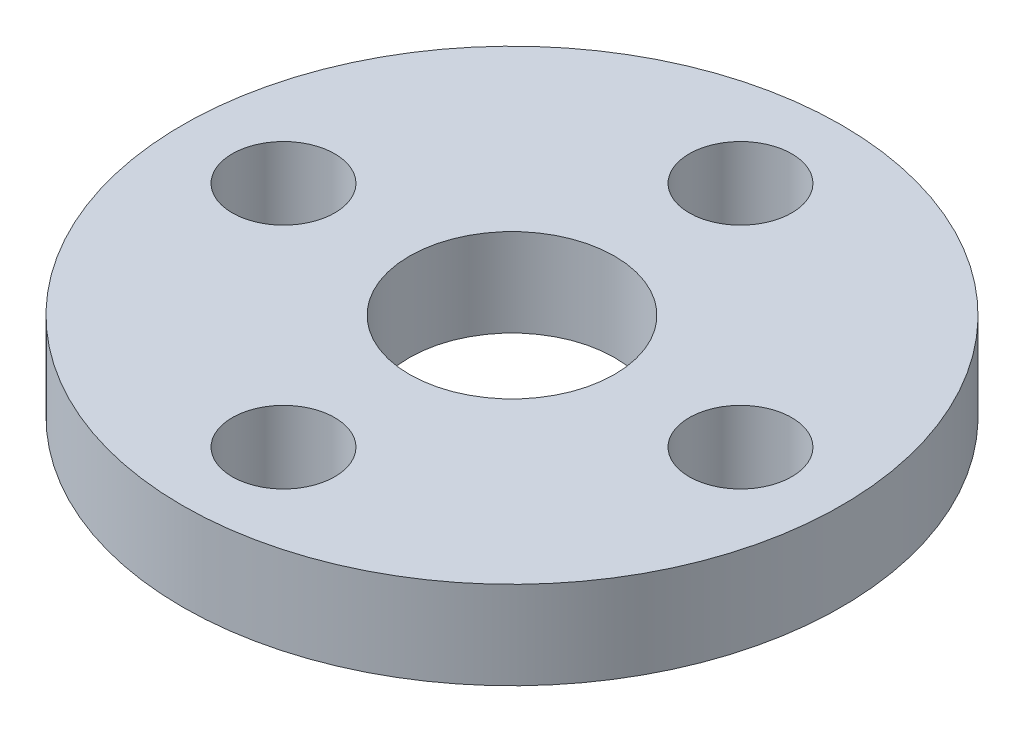
ISO-10303-21;
HEADER;
FILE_DESCRIPTION(('STEP AP214'),'2;1');
FILE_NAME('part.step','',(''),(''),'','','');
FILE_SCHEMA(('AUTOMOTIVE_DESIGN { 1 0 10303 214 1 1 1 1 }'));
ENDSEC;
DATA;
#1=APPLICATION_CONTEXT('core data for automotive mechanical design processes');
#2=APPLICATION_PROTOCOL_DEFINITION('international standard','automotive_design',2000,#1);
#3=PRODUCT_CONTEXT('',#1,'mechanical');
#4=PRODUCT('Part','Part','',(#3));
#5=PRODUCT_RELATED_PRODUCT_CATEGORY('part','',(#4));
#6=PRODUCT_DEFINITION_FORMATION('','',#4);
#7=PRODUCT_DEFINITION_CONTEXT('part definition',#1,'design');
#8=PRODUCT_DEFINITION('design','',#6,#7);
#9=PRODUCT_DEFINITION_SHAPE('','',#8);
#10=(LENGTH_UNIT() NAMED_UNIT(*) SI_UNIT(.MILLI.,.METRE.));
#11=(NAMED_UNIT(*) PLANE_ANGLE_UNIT() SI_UNIT($,.RADIAN.));
#12=(NAMED_UNIT(*) SI_UNIT($,.STERADIAN.) SOLID_ANGLE_UNIT());
#13=UNCERTAINTY_MEASURE_WITH_UNIT(LENGTH_MEASURE(1.E-05),#10,'distance_accuracy_value','');
#14=(GEOMETRIC_REPRESENTATION_CONTEXT(3) GLOBAL_UNCERTAINTY_ASSIGNED_CONTEXT((#13)) GLOBAL_UNIT_ASSIGNED_CONTEXT((#10,
#11,#12)) REPRESENTATION_CONTEXT('',''));
#15=CARTESIAN_POINT('',(0.,0.,0.));
#16=DIRECTION('',(0.,0.,1.));
#17=DIRECTION('',(1.,0.,0.));
#18=AXIS2_PLACEMENT_3D('',#15,#16,#17);
#19=CARTESIAN_POINT('',(0.,3.,0.));
#20=DIRECTION('',(0.,-1.,0.));
#21=DIRECTION('',(0.,0.,-1.));
#22=AXIS2_PLACEMENT_3D('',#19,#20,#21);
#23=CYLINDRICAL_SURFACE('',#22,11.25);
#24=CARTESIAN_POINT('',(0.,3.,0.));
#25=DIRECTION('',(0.,1.,0.));
#26=DIRECTION('',(0.,0.,1.));
#27=AXIS2_PLACEMENT_3D('',#24,#25,#26);
#28=CIRCLE('',#27,11.25);
#29=CARTESIAN_POINT('',(0.,3.,11.25));
#30=VERTEX_POINT('',#29);
#31=EDGE_CURVE('E10',#30,#30,#28,.T.);
#32=ORIENTED_EDGE('',*,*,#31,.F.);
#33=EDGE_LOOP('',(#32));
#34=FACE_BOUND('',#33,.T.);
#35=CARTESIAN_POINT('',(0.,0.,0.));
#36=DIRECTION('',(0.,1.,0.));
#37=DIRECTION('',(0.,0.,1.));
#38=AXIS2_PLACEMENT_3D('',#35,#36,#37);
#39=CIRCLE('',#38,11.25);
#40=CARTESIAN_POINT('',(0.,0.,11.25));
#41=VERTEX_POINT('',#40);
#42=EDGE_CURVE('E34',#41,#41,#39,.T.);
#43=ORIENTED_EDGE('',*,*,#42,.T.);
#44=EDGE_LOOP('',(#43));
#45=FACE_BOUND('',#44,.T.);
#46=ADVANCED_FACE('F31',(#34,#45),#23,.T.);
#47=CARTESIAN_POINT('',(0.,3.,0.));
#48=DIRECTION('',(0.,1.,0.));
#49=DIRECTION('',(0.,0.,1.));
#50=AXIS2_PLACEMENT_3D('',#47,#48,#49);
#51=PLANE('',#50);
#52=CARTESIAN_POINT('',(0.,3.,-7.8));
#53=DIRECTION('',(0.,1.,0.));
#54=DIRECTION('',(0.,0.,1.));
#55=AXIS2_PLACEMENT_3D('',#52,#53,#54);
#56=CIRCLE('',#55,1.75);
#57=CARTESIAN_POINT('',(0.,3.,-6.05));
#58=VERTEX_POINT('',#57);
#59=EDGE_CURVE('E54',#58,#58,#56,.T.);
#60=ORIENTED_EDGE('',*,*,#59,.F.);
#61=EDGE_LOOP('',(#60));
#62=FACE_BOUND('',#61,.T.);
#63=CARTESIAN_POINT('',(0.,3.,0.));
#64=DIRECTION('',(0.,1.,0.));
#65=DIRECTION('',(0.,0.,1.));
#66=AXIS2_PLACEMENT_3D('',#63,#64,#65);
#67=CIRCLE('',#66,3.5);
#68=CARTESIAN_POINT('',(0.,3.,3.5));
#69=VERTEX_POINT('',#68);
#70=EDGE_CURVE('E61',#69,#69,#67,.T.);
#71=ORIENTED_EDGE('',*,*,#70,.F.);
#72=EDGE_LOOP('',(#71));
#73=FACE_BOUND('',#72,.T.);
#74=CARTESIAN_POINT('',(-7.8,3.,0.));
#75=DIRECTION('',(0.,1.,0.));
#76=DIRECTION('',(0.,0.,1.));
#77=AXIS2_PLACEMENT_3D('',#74,#75,#76);
#78=CIRCLE('',#77,1.75);
#79=CARTESIAN_POINT('',(-7.8,3.,1.75));
#80=VERTEX_POINT('',#79);
#81=EDGE_CURVE('E60',#80,#80,#78,.T.);
#82=ORIENTED_EDGE('',*,*,#81,.F.);
#83=EDGE_LOOP('',(#82));
#84=FACE_BOUND('',#83,.T.);
#85=CARTESIAN_POINT('',(0.,3.,7.8));
#86=DIRECTION('',(0.,1.,0.));
#87=DIRECTION('',(0.,0.,1.));
#88=AXIS2_PLACEMENT_3D('',#85,#86,#87);
#89=CIRCLE('',#88,1.75);
#90=CARTESIAN_POINT('',(0.,3.,9.55));
#91=VERTEX_POINT('',#90);
#92=EDGE_CURVE('E47',#91,#91,#89,.T.);
#93=ORIENTED_EDGE('',*,*,#92,.F.);
#94=EDGE_LOOP('',(#93));
#95=FACE_BOUND('',#94,.T.);
#96=CARTESIAN_POINT('',(7.8,3.,0.));
#97=DIRECTION('',(0.,1.,0.));
#98=DIRECTION('',(0.,0.,1.));
#99=AXIS2_PLACEMENT_3D('',#96,#97,#98);
#100=CIRCLE('',#99,1.75);
#101=CARTESIAN_POINT('',(7.8,3.,1.75));
#102=VERTEX_POINT('',#101);
#103=EDGE_CURVE('E46',#102,#102,#100,.T.);
#104=ORIENTED_EDGE('',*,*,#103,.F.);
#105=EDGE_LOOP('',(#104));
#106=FACE_BOUND('',#105,.T.);
#107=ORIENTED_EDGE('',*,*,#31,.T.);
#108=EDGE_LOOP('',(#107));
#109=FACE_BOUND('',#108,.T.);
#110=ADVANCED_FACE('F76',(#62,#73,#84,#95,#106,#109),#51,.T.);
#111=CARTESIAN_POINT('',(0.,0.,0.));
#112=DIRECTION('',(0.,1.,0.));
#113=DIRECTION('',(0.,0.,1.));
#114=AXIS2_PLACEMENT_3D('',#111,#112,#113);
#115=PLANE('',#114);
#116=CARTESIAN_POINT('',(0.,0.,-7.8));
#117=DIRECTION('',(0.,1.,0.));
#118=DIRECTION('',(0.,0.,1.));
#119=AXIS2_PLACEMENT_3D('',#116,#117,#118);
#120=CIRCLE('',#119,1.75);
#121=CARTESIAN_POINT('',(0.,0.,-6.05));
#122=VERTEX_POINT('',#121);
#123=EDGE_CURVE('E41',#122,#122,#120,.F.);
#124=ORIENTED_EDGE('',*,*,#123,.F.);
#125=EDGE_LOOP('',(#124));
#126=FACE_BOUND('',#125,.T.);
#127=CARTESIAN_POINT('',(0.,0.,0.));
#128=DIRECTION('',(0.,1.,0.));
#129=DIRECTION('',(0.,0.,1.));
#130=AXIS2_PLACEMENT_3D('',#127,#128,#129);
#131=CIRCLE('',#130,3.5);
#132=CARTESIAN_POINT('',(0.,0.,3.5));
#133=VERTEX_POINT('',#132);
#134=EDGE_CURVE('E57',#133,#133,#131,.F.);
#135=ORIENTED_EDGE('',*,*,#134,.F.);
#136=EDGE_LOOP('',(#135));
#137=FACE_BOUND('',#136,.T.);
#138=CARTESIAN_POINT('',(-7.8,0.,0.));
#139=DIRECTION('',(0.,1.,0.));
#140=DIRECTION('',(0.,0.,1.));
#141=AXIS2_PLACEMENT_3D('',#138,#139,#140);
#142=CIRCLE('',#141,1.75);
#143=CARTESIAN_POINT('',(-7.8,0.,1.75));
#144=VERTEX_POINT('',#143);
#145=EDGE_CURVE('E50',#144,#144,#142,.F.);
#146=ORIENTED_EDGE('',*,*,#145,.F.);
#147=EDGE_LOOP('',(#146));
#148=FACE_BOUND('',#147,.T.);
#149=CARTESIAN_POINT('',(0.,0.,7.8));
#150=DIRECTION('',(0.,1.,0.));
#151=DIRECTION('',(0.,0.,1.));
#152=AXIS2_PLACEMENT_3D('',#149,#150,#151);
#153=CIRCLE('',#152,1.75);
#154=CARTESIAN_POINT('',(0.,0.,9.55));
#155=VERTEX_POINT('',#154);
#156=EDGE_CURVE('E43',#155,#155,#153,.F.);
#157=ORIENTED_EDGE('',*,*,#156,.F.);
#158=EDGE_LOOP('',(#157));
#159=FACE_BOUND('',#158,.T.);
#160=CARTESIAN_POINT('',(7.8,0.,0.));
#161=DIRECTION('',(0.,1.,0.));
#162=DIRECTION('',(0.,0.,1.));
#163=AXIS2_PLACEMENT_3D('',#160,#161,#162);
#164=CIRCLE('',#163,1.75);
#165=CARTESIAN_POINT('',(7.8,0.,1.75));
#166=VERTEX_POINT('',#165);
#167=EDGE_CURVE('E51',#166,#166,#164,.F.);
#168=ORIENTED_EDGE('',*,*,#167,.F.);
#169=EDGE_LOOP('',(#168));
#170=FACE_BOUND('',#169,.T.);
#171=ORIENTED_EDGE('',*,*,#42,.F.);
#172=EDGE_LOOP('',(#171));
#173=FACE_BOUND('',#172,.T.);
#174=ADVANCED_FACE('F79',(#126,#137,#148,#159,#170,#173),#115,.F.);
#175=CARTESIAN_POINT('',(7.8,-0.00100000000000013,0.));
#176=DIRECTION('',(0.,1.,0.));
#177=DIRECTION('',(0.,0.,1.));
#178=AXIS2_PLACEMENT_3D('',#175,#176,#177);
#179=CYLINDRICAL_SURFACE('',#178,1.75);
#180=CARTESIAN_POINT('',(7.8,3.,1.75));
#181=CARTESIAN_POINT('',(7.8,2.96875,1.75));
#182=CARTESIAN_POINT('',(7.8,2.9375,1.75));
#183=CARTESIAN_POINT('',(7.8,2.875,1.75));
#184=CARTESIAN_POINT('',(7.8,2.84375,1.75));
#185=CARTESIAN_POINT('',(7.8,2.78125,1.75));
#186=CARTESIAN_POINT('',(7.8,2.75,1.75));
#187=CARTESIAN_POINT('',(7.8,2.6875,1.75));
#188=CARTESIAN_POINT('',(7.8,2.65625,1.75));
#189=CARTESIAN_POINT('',(7.8,2.59375,1.75));
#190=CARTESIAN_POINT('',(7.8,2.5625,1.75));
#191=CARTESIAN_POINT('',(7.8,2.5,1.75));
#192=CARTESIAN_POINT('',(7.8,2.46875,1.75));
#193=CARTESIAN_POINT('',(7.8,2.40625,1.75));
#194=CARTESIAN_POINT('',(7.8,2.375,1.75));
#195=CARTESIAN_POINT('',(7.8,2.3125,1.75));
#196=CARTESIAN_POINT('',(7.8,2.28125,1.75));
#197=CARTESIAN_POINT('',(7.8,2.21875,1.75));
#198=CARTESIAN_POINT('',(7.8,2.1875,1.75));
#199=CARTESIAN_POINT('',(7.8,2.125,1.75));
#200=CARTESIAN_POINT('',(7.8,2.09375,1.75));
#201=CARTESIAN_POINT('',(7.8,2.03125,1.75));
#202=CARTESIAN_POINT('',(7.8,2.,1.75));
#203=CARTESIAN_POINT('',(7.8,1.9375,1.75));
#204=CARTESIAN_POINT('',(7.8,1.90625,1.75));
#205=CARTESIAN_POINT('',(7.8,1.84375,1.75));
#206=CARTESIAN_POINT('',(7.8,1.8125,1.75));
#207=CARTESIAN_POINT('',(7.8,1.75,1.75));
#208=CARTESIAN_POINT('',(7.8,1.71875,1.75));
#209=CARTESIAN_POINT('',(7.8,1.65625,1.75));
#210=CARTESIAN_POINT('',(7.8,1.625,1.75));
#211=CARTESIAN_POINT('',(7.8,1.5625,1.75));
#212=CARTESIAN_POINT('',(7.8,1.53125,1.75));
#213=CARTESIAN_POINT('',(7.8,1.46875,1.75));
#214=CARTESIAN_POINT('',(7.8,1.4375,1.75));
#215=CARTESIAN_POINT('',(7.8,1.375,1.75));
#216=CARTESIAN_POINT('',(7.8,1.34375,1.75));
#217=CARTESIAN_POINT('',(7.8,1.28125,1.75));
#218=CARTESIAN_POINT('',(7.8,1.25,1.75));
#219=CARTESIAN_POINT('',(7.8,1.1875,1.75));
#220=CARTESIAN_POINT('',(7.8,1.15625,1.75));
#221=CARTESIAN_POINT('',(7.8,1.09375,1.75));
#222=CARTESIAN_POINT('',(7.8,1.0625,1.75));
#223=CARTESIAN_POINT('',(7.8,1.,1.75));
#224=CARTESIAN_POINT('',(7.8,0.96875,1.75));
#225=CARTESIAN_POINT('',(7.8,0.90625,1.75));
#226=CARTESIAN_POINT('',(7.8,0.875,1.75));
#227=CARTESIAN_POINT('',(7.8,0.8125,1.75));
#228=CARTESIAN_POINT('',(7.8,0.78125,1.75));
#229=CARTESIAN_POINT('',(7.8,0.71875,1.75));
#230=CARTESIAN_POINT('',(7.8,0.6875,1.75));
#231=CARTESIAN_POINT('',(7.8,0.625,1.75));
#232=CARTESIAN_POINT('',(7.8,0.59375,1.75));
#233=CARTESIAN_POINT('',(7.8,0.53125,1.75));
#234=CARTESIAN_POINT('',(7.8,0.5,1.75));
#235=CARTESIAN_POINT('',(7.8,0.4375,1.75));
#236=CARTESIAN_POINT('',(7.8,0.40625,1.75));
#237=CARTESIAN_POINT('',(7.8,0.34375,1.75));
#238=CARTESIAN_POINT('',(7.8,0.3125,1.75));
#239=CARTESIAN_POINT('',(7.8,0.25,1.75));
#240=CARTESIAN_POINT('',(7.8,0.21875,1.75));
#241=CARTESIAN_POINT('',(7.8,0.15625,1.75));
#242=CARTESIAN_POINT('',(7.8,0.125,1.75));
#243=CARTESIAN_POINT('',(7.8,0.0625000000000001,1.75));
#244=CARTESIAN_POINT('',(7.8,0.0312500000000001,1.75));
#245=CARTESIAN_POINT('',(7.8,0.,1.75));
#246=B_SPLINE_CURVE_WITH_KNOTS('',3,(#180,#181,#182,#183,#184,#185,#186,#187,#188,#189,#190,
#191,#192,#193,#194,#195,#196,#197,#198,#199,#200,#201,#202,#203,#204,#205,#206,#207,#208,#209,
#210,#211,#212,#213,#214,#215,#216,#217,#218,#219,#220,#221,#222,#223,#224,#225,#226,#227,#228,
#229,#230,#231,#232,#233,#234,#235,#236,#237,#238,#239,#240,#241,#242,#243,#244,#245),
.UNSPECIFIED.,.F.,.F.,(4,2,2,2,2,2,2,2,2,2,2,2,2,2,2,2,2,2,2,2,2,2,2,2,2,2,2,2,2,2,2,2,4),(0.,
0.0937500000000001,0.1875,0.28125,0.375,0.46875,0.5625,0.65625,0.75,0.84375,0.9375,1.03125,
1.125,1.21875,1.3125,1.40625,1.5,1.59375,1.6875,1.78125,1.875,1.96875,2.0625,2.15625,2.25,
2.34375,2.4375,2.53125,2.625,2.71875,2.8125,2.90625,3.),.UNSPECIFIED.);
#247=EDGE_CURVE('BSEAM89',#102,#166,#246,.T.);
#248=ORIENTED_EDGE('',*,*,#103,.T.);
#249=ORIENTED_EDGE('',*,*,#167,.T.);
#250=ORIENTED_EDGE('',*,*,#247,.T.);
#251=ORIENTED_EDGE('',*,*,#247,.F.);
#252=EDGE_LOOP('',(#248,#250,#249,#251));
#253=FACE_BOUND('',#252,.T.);
#254=ADVANCED_FACE('F89',(#253),#179,.F.);
#255=CARTESIAN_POINT('',(0.,-0.00100000000000013,7.8));
#256=DIRECTION('',(0.,1.,0.));
#257=DIRECTION('',(0.,0.,1.));
#258=AXIS2_PLACEMENT_3D('',#255,#256,#257);
#259=CYLINDRICAL_SURFACE('',#258,1.75);
#260=CARTESIAN_POINT('',(0.,3.,9.55));
#261=CARTESIAN_POINT('',(0.,2.96875,9.55));
#262=CARTESIAN_POINT('',(0.,2.9375,9.55));
#263=CARTESIAN_POINT('',(0.,2.875,9.55));
#264=CARTESIAN_POINT('',(0.,2.84375,9.55));
#265=CARTESIAN_POINT('',(0.,2.78125,9.55));
#266=CARTESIAN_POINT('',(0.,2.75,9.55));
#267=CARTESIAN_POINT('',(0.,2.6875,9.55));
#268=CARTESIAN_POINT('',(0.,2.65625,9.55));
#269=CARTESIAN_POINT('',(0.,2.59375,9.55));
#270=CARTESIAN_POINT('',(0.,2.5625,9.55));
#271=CARTESIAN_POINT('',(0.,2.5,9.55));
#272=CARTESIAN_POINT('',(0.,2.46875,9.55));
#273=CARTESIAN_POINT('',(0.,2.40625,9.55));
#274=CARTESIAN_POINT('',(0.,2.375,9.55));
#275=CARTESIAN_POINT('',(0.,2.3125,9.55));
#276=CARTESIAN_POINT('',(0.,2.28125,9.55));
#277=CARTESIAN_POINT('',(0.,2.21875,9.55));
#278=CARTESIAN_POINT('',(0.,2.1875,9.55));
#279=CARTESIAN_POINT('',(0.,2.125,9.55));
#280=CARTESIAN_POINT('',(0.,2.09375,9.55));
#281=CARTESIAN_POINT('',(0.,2.03125,9.55));
#282=CARTESIAN_POINT('',(0.,2.,9.55));
#283=CARTESIAN_POINT('',(0.,1.9375,9.55));
#284=CARTESIAN_POINT('',(0.,1.90625,9.55));
#285=CARTESIAN_POINT('',(0.,1.84375,9.55));
#286=CARTESIAN_POINT('',(0.,1.8125,9.55));
#287=CARTESIAN_POINT('',(0.,1.75,9.55));
#288=CARTESIAN_POINT('',(0.,1.71875,9.55));
#289=CARTESIAN_POINT('',(0.,1.65625,9.55));
#290=CARTESIAN_POINT('',(0.,1.625,9.55));
#291=CARTESIAN_POINT('',(0.,1.5625,9.55));
#292=CARTESIAN_POINT('',(0.,1.53125,9.55));
#293=CARTESIAN_POINT('',(0.,1.46875,9.55));
#294=CARTESIAN_POINT('',(0.,1.4375,9.55));
#295=CARTESIAN_POINT('',(0.,1.375,9.55));
#296=CARTESIAN_POINT('',(0.,1.34375,9.55));
#297=CARTESIAN_POINT('',(0.,1.28125,9.55));
#298=CARTESIAN_POINT('',(0.,1.25,9.55));
#299=CARTESIAN_POINT('',(0.,1.1875,9.55));
#300=CARTESIAN_POINT('',(0.,1.15625,9.55));
#301=CARTESIAN_POINT('',(0.,1.09375,9.55));
#302=CARTESIAN_POINT('',(0.,1.0625,9.55));
#303=CARTESIAN_POINT('',(0.,1.,9.55));
#304=CARTESIAN_POINT('',(0.,0.96875,9.55));
#305=CARTESIAN_POINT('',(0.,0.90625,9.55));
#306=CARTESIAN_POINT('',(0.,0.875,9.55));
#307=CARTESIAN_POINT('',(0.,0.8125,9.55));
#308=CARTESIAN_POINT('',(0.,0.78125,9.55));
#309=CARTESIAN_POINT('',(0.,0.71875,9.55));
#310=CARTESIAN_POINT('',(0.,0.6875,9.55));
#311=CARTESIAN_POINT('',(0.,0.625,9.55));
#312=CARTESIAN_POINT('',(0.,0.59375,9.55));
#313=CARTESIAN_POINT('',(0.,0.53125,9.55));
#314=CARTESIAN_POINT('',(0.,0.5,9.55));
#315=CARTESIAN_POINT('',(0.,0.4375,9.55));
#316=CARTESIAN_POINT('',(0.,0.40625,9.55));
#317=CARTESIAN_POINT('',(0.,0.34375,9.55));
#318=CARTESIAN_POINT('',(0.,0.3125,9.55));
#319=CARTESIAN_POINT('',(0.,0.25,9.55));
#320=CARTESIAN_POINT('',(0.,0.21875,9.55));
#321=CARTESIAN_POINT('',(0.,0.15625,9.55));
#322=CARTESIAN_POINT('',(0.,0.125,9.55));
#323=CARTESIAN_POINT('',(0.,0.0625000000000001,9.55));
#324=CARTESIAN_POINT('',(0.,0.0312500000000001,9.55));
#325=CARTESIAN_POINT('',(0.,0.,9.55));
#326=B_SPLINE_CURVE_WITH_KNOTS('',3,(#260,#261,#262,#263,#264,#265,#266,#267,#268,#269,#270,
#271,#272,#273,#274,#275,#276,#277,#278,#279,#280,#281,#282,#283,#284,#285,#286,#287,#288,#289,
#290,#291,#292,#293,#294,#295,#296,#297,#298,#299,#300,#301,#302,#303,#304,#305,#306,#307,#308,
#309,#310,#311,#312,#313,#314,#315,#316,#317,#318,#319,#320,#321,#322,#323,#324,#325),
.UNSPECIFIED.,.F.,.F.,(4,2,2,2,2,2,2,2,2,2,2,2,2,2,2,2,2,2,2,2,2,2,2,2,2,2,2,2,2,2,2,2,4),(0.,
0.0937500000000001,0.1875,0.28125,0.375,0.46875,0.5625,0.65625,0.75,0.84375,0.9375,1.03125,
1.125,1.21875,1.3125,1.40625,1.5,1.59375,1.6875,1.78125,1.875,1.96875,2.0625,2.15625,2.25,
2.34375,2.4375,2.53125,2.625,2.71875,2.8125,2.90625,3.),.UNSPECIFIED.);
#327=EDGE_CURVE('BSEAM92',#91,#155,#326,.T.);
#328=ORIENTED_EDGE('',*,*,#92,.T.);
#329=ORIENTED_EDGE('',*,*,#156,.T.);
#330=ORIENTED_EDGE('',*,*,#327,.T.);
#331=ORIENTED_EDGE('',*,*,#327,.F.);
#332=EDGE_LOOP('',(#328,#330,#329,#331));
#333=FACE_BOUND('',#332,.T.);
#334=ADVANCED_FACE('F92',(#333),#259,.F.);
#335=CARTESIAN_POINT('',(-7.8,-0.00100000000000013,0.));
#336=DIRECTION('',(0.,1.,0.));
#337=DIRECTION('',(0.,0.,1.));
#338=AXIS2_PLACEMENT_3D('',#335,#336,#337);
#339=CYLINDRICAL_SURFACE('',#338,1.75);
#340=CARTESIAN_POINT('',(-7.8,3.,1.75));
#341=CARTESIAN_POINT('',(-7.8,2.96875,1.75));
#342=CARTESIAN_POINT('',(-7.8,2.9375,1.75));
#343=CARTESIAN_POINT('',(-7.8,2.875,1.75));
#344=CARTESIAN_POINT('',(-7.8,2.84375,1.75));
#345=CARTESIAN_POINT('',(-7.8,2.78125,1.75));
#346=CARTESIAN_POINT('',(-7.8,2.75,1.75));
#347=CARTESIAN_POINT('',(-7.8,2.6875,1.75));
#348=CARTESIAN_POINT('',(-7.8,2.65625,1.75));
#349=CARTESIAN_POINT('',(-7.8,2.59375,1.75));
#350=CARTESIAN_POINT('',(-7.8,2.5625,1.75));
#351=CARTESIAN_POINT('',(-7.8,2.5,1.75));
#352=CARTESIAN_POINT('',(-7.8,2.46875,1.75));
#353=CARTESIAN_POINT('',(-7.8,2.40625,1.75));
#354=CARTESIAN_POINT('',(-7.8,2.375,1.75));
#355=CARTESIAN_POINT('',(-7.8,2.3125,1.75));
#356=CARTESIAN_POINT('',(-7.8,2.28125,1.75));
#357=CARTESIAN_POINT('',(-7.8,2.21875,1.75));
#358=CARTESIAN_POINT('',(-7.8,2.1875,1.75));
#359=CARTESIAN_POINT('',(-7.8,2.125,1.75));
#360=CARTESIAN_POINT('',(-7.8,2.09375,1.75));
#361=CARTESIAN_POINT('',(-7.8,2.03125,1.75));
#362=CARTESIAN_POINT('',(-7.8,2.,1.75));
#363=CARTESIAN_POINT('',(-7.8,1.9375,1.75));
#364=CARTESIAN_POINT('',(-7.8,1.90625,1.75));
#365=CARTESIAN_POINT('',(-7.8,1.84375,1.75));
#366=CARTESIAN_POINT('',(-7.8,1.8125,1.75));
#367=CARTESIAN_POINT('',(-7.8,1.75,1.75));
#368=CARTESIAN_POINT('',(-7.8,1.71875,1.75));
#369=CARTESIAN_POINT('',(-7.8,1.65625,1.75));
#370=CARTESIAN_POINT('',(-7.8,1.625,1.75));
#371=CARTESIAN_POINT('',(-7.8,1.5625,1.75));
#372=CARTESIAN_POINT('',(-7.8,1.53125,1.75));
#373=CARTESIAN_POINT('',(-7.8,1.46875,1.75));
#374=CARTESIAN_POINT('',(-7.8,1.4375,1.75));
#375=CARTESIAN_POINT('',(-7.8,1.375,1.75));
#376=CARTESIAN_POINT('',(-7.8,1.34375,1.75));
#377=CARTESIAN_POINT('',(-7.8,1.28125,1.75));
#378=CARTESIAN_POINT('',(-7.8,1.25,1.75));
#379=CARTESIAN_POINT('',(-7.8,1.1875,1.75));
#380=CARTESIAN_POINT('',(-7.8,1.15625,1.75));
#381=CARTESIAN_POINT('',(-7.8,1.09375,1.75));
#382=CARTESIAN_POINT('',(-7.8,1.0625,1.75));
#383=CARTESIAN_POINT('',(-7.8,1.,1.75));
#384=CARTESIAN_POINT('',(-7.8,0.96875,1.75));
#385=CARTESIAN_POINT('',(-7.8,0.90625,1.75));
#386=CARTESIAN_POINT('',(-7.8,0.875,1.75));
#387=CARTESIAN_POINT('',(-7.8,0.8125,1.75));
#388=CARTESIAN_POINT('',(-7.8,0.78125,1.75));
#389=CARTESIAN_POINT('',(-7.8,0.71875,1.75));
#390=CARTESIAN_POINT('',(-7.8,0.6875,1.75));
#391=CARTESIAN_POINT('',(-7.8,0.625,1.75));
#392=CARTESIAN_POINT('',(-7.8,0.59375,1.75));
#393=CARTESIAN_POINT('',(-7.8,0.53125,1.75));
#394=CARTESIAN_POINT('',(-7.8,0.5,1.75));
#395=CARTESIAN_POINT('',(-7.8,0.4375,1.75));
#396=CARTESIAN_POINT('',(-7.8,0.40625,1.75));
#397=CARTESIAN_POINT('',(-7.8,0.34375,1.75));
#398=CARTESIAN_POINT('',(-7.8,0.3125,1.75));
#399=CARTESIAN_POINT('',(-7.8,0.25,1.75));
#400=CARTESIAN_POINT('',(-7.8,0.21875,1.75));
#401=CARTESIAN_POINT('',(-7.8,0.15625,1.75));
#402=CARTESIAN_POINT('',(-7.8,0.125,1.75));
#403=CARTESIAN_POINT('',(-7.8,0.0625000000000001,1.75));
#404=CARTESIAN_POINT('',(-7.8,0.0312500000000001,1.75));
#405=CARTESIAN_POINT('',(-7.8,0.,1.75));
#406=B_SPLINE_CURVE_WITH_KNOTS('',3,(#340,#341,#342,#343,#344,#345,#346,#347,#348,#349,#350,
#351,#352,#353,#354,#355,#356,#357,#358,#359,#360,#361,#362,#363,#364,#365,#366,#367,#368,#369,
#370,#371,#372,#373,#374,#375,#376,#377,#378,#379,#380,#381,#382,#383,#384,#385,#386,#387,#388,
#389,#390,#391,#392,#393,#394,#395,#396,#397,#398,#399,#400,#401,#402,#403,#404,#405),
.UNSPECIFIED.,.F.,.F.,(4,2,2,2,2,2,2,2,2,2,2,2,2,2,2,2,2,2,2,2,2,2,2,2,2,2,2,2,2,2,2,2,4),(0.,
0.0937500000000001,0.1875,0.28125,0.375,0.46875,0.5625,0.65625,0.75,0.84375,0.9375,1.03125,
1.125,1.21875,1.3125,1.40625,1.5,1.59375,1.6875,1.78125,1.875,1.96875,2.0625,2.15625,2.25,
2.34375,2.4375,2.53125,2.625,2.71875,2.8125,2.90625,3.),.UNSPECIFIED.);
#407=EDGE_CURVE('BSEAM123',#80,#144,#406,.T.);
#408=ORIENTED_EDGE('',*,*,#81,.T.);
#409=ORIENTED_EDGE('',*,*,#145,.T.);
#410=ORIENTED_EDGE('',*,*,#407,.T.);
#411=ORIENTED_EDGE('',*,*,#407,.F.);
#412=EDGE_LOOP('',(#408,#410,#409,#411));
#413=FACE_BOUND('',#412,.T.);
#414=ADVANCED_FACE('F123',(#413),#339,.F.);
#415=CARTESIAN_POINT('',(0.,-0.00100000000000013,0.));
#416=DIRECTION('',(0.,1.,0.));
#417=DIRECTION('',(0.,0.,1.));
#418=AXIS2_PLACEMENT_3D('',#415,#416,#417);
#419=CYLINDRICAL_SURFACE('',#418,3.5);
#420=CARTESIAN_POINT('',(0.,3.,3.5));
#421=CARTESIAN_POINT('',(0.,2.96875,3.5));
#422=CARTESIAN_POINT('',(0.,2.9375,3.5));
#423=CARTESIAN_POINT('',(0.,2.875,3.5));
#424=CARTESIAN_POINT('',(0.,2.84375,3.5));
#425=CARTESIAN_POINT('',(0.,2.78125,3.5));
#426=CARTESIAN_POINT('',(0.,2.75,3.5));
#427=CARTESIAN_POINT('',(0.,2.6875,3.5));
#428=CARTESIAN_POINT('',(0.,2.65625,3.5));
#429=CARTESIAN_POINT('',(0.,2.59375,3.5));
#430=CARTESIAN_POINT('',(0.,2.5625,3.5));
#431=CARTESIAN_POINT('',(0.,2.5,3.5));
#432=CARTESIAN_POINT('',(0.,2.46875,3.5));
#433=CARTESIAN_POINT('',(0.,2.40625,3.5));
#434=CARTESIAN_POINT('',(0.,2.375,3.5));
#435=CARTESIAN_POINT('',(0.,2.3125,3.5));
#436=CARTESIAN_POINT('',(0.,2.28125,3.5));
#437=CARTESIAN_POINT('',(0.,2.21875,3.5));
#438=CARTESIAN_POINT('',(0.,2.1875,3.5));
#439=CARTESIAN_POINT('',(0.,2.125,3.5));
#440=CARTESIAN_POINT('',(0.,2.09375,3.5));
#441=CARTESIAN_POINT('',(0.,2.03125,3.5));
#442=CARTESIAN_POINT('',(0.,2.,3.5));
#443=CARTESIAN_POINT('',(0.,1.9375,3.5));
#444=CARTESIAN_POINT('',(0.,1.90625,3.5));
#445=CARTESIAN_POINT('',(0.,1.84375,3.5));
#446=CARTESIAN_POINT('',(0.,1.8125,3.5));
#447=CARTESIAN_POINT('',(0.,1.75,3.5));
#448=CARTESIAN_POINT('',(0.,1.71875,3.5));
#449=CARTESIAN_POINT('',(0.,1.65625,3.5));
#450=CARTESIAN_POINT('',(0.,1.625,3.5));
#451=CARTESIAN_POINT('',(0.,1.5625,3.5));
#452=CARTESIAN_POINT('',(0.,1.53125,3.5));
#453=CARTESIAN_POINT('',(0.,1.46875,3.5));
#454=CARTESIAN_POINT('',(0.,1.4375,3.5));
#455=CARTESIAN_POINT('',(0.,1.375,3.5));
#456=CARTESIAN_POINT('',(0.,1.34375,3.5));
#457=CARTESIAN_POINT('',(0.,1.28125,3.5));
#458=CARTESIAN_POINT('',(0.,1.25,3.5));
#459=CARTESIAN_POINT('',(0.,1.1875,3.5));
#460=CARTESIAN_POINT('',(0.,1.15625,3.5));
#461=CARTESIAN_POINT('',(0.,1.09375,3.5));
#462=CARTESIAN_POINT('',(0.,1.0625,3.5));
#463=CARTESIAN_POINT('',(0.,1.,3.5));
#464=CARTESIAN_POINT('',(0.,0.96875,3.5));
#465=CARTESIAN_POINT('',(0.,0.90625,3.5));
#466=CARTESIAN_POINT('',(0.,0.875,3.5));
#467=CARTESIAN_POINT('',(0.,0.8125,3.5));
#468=CARTESIAN_POINT('',(0.,0.78125,3.5));
#469=CARTESIAN_POINT('',(0.,0.71875,3.5));
#470=CARTESIAN_POINT('',(0.,0.6875,3.5));
#471=CARTESIAN_POINT('',(0.,0.625,3.5));
#472=CARTESIAN_POINT('',(0.,0.59375,3.5));
#473=CARTESIAN_POINT('',(0.,0.53125,3.5));
#474=CARTESIAN_POINT('',(0.,0.5,3.5));
#475=CARTESIAN_POINT('',(0.,0.4375,3.5));
#476=CARTESIAN_POINT('',(0.,0.40625,3.5));
#477=CARTESIAN_POINT('',(0.,0.34375,3.5));
#478=CARTESIAN_POINT('',(0.,0.3125,3.5));
#479=CARTESIAN_POINT('',(0.,0.25,3.5));
#480=CARTESIAN_POINT('',(0.,0.21875,3.5));
#481=CARTESIAN_POINT('',(0.,0.15625,3.5));
#482=CARTESIAN_POINT('',(0.,0.125,3.5));
#483=CARTESIAN_POINT('',(0.,0.0625000000000001,3.5));
#484=CARTESIAN_POINT('',(0.,0.0312500000000001,3.5));
#485=CARTESIAN_POINT('',(0.,0.,3.5));
#486=B_SPLINE_CURVE_WITH_KNOTS('',3,(#420,#421,#422,#423,#424,#425,#426,#427,#428,#429,#430,
#431,#432,#433,#434,#435,#436,#437,#438,#439,#440,#441,#442,#443,#444,#445,#446,#447,#448,#449,
#450,#451,#452,#453,#454,#455,#456,#457,#458,#459,#460,#461,#462,#463,#464,#465,#466,#467,#468,
#469,#470,#471,#472,#473,#474,#475,#476,#477,#478,#479,#480,#481,#482,#483,#484,#485),
.UNSPECIFIED.,.F.,.F.,(4,2,2,2,2,2,2,2,2,2,2,2,2,2,2,2,2,2,2,2,2,2,2,2,2,2,2,2,2,2,2,2,4),(0.,
0.0937500000000001,0.1875,0.28125,0.375,0.46875,0.5625,0.65625,0.75,0.84375,0.9375,1.03125,
1.125,1.21875,1.3125,1.40625,1.5,1.59375,1.6875,1.78125,1.875,1.96875,2.0625,2.15625,2.25,
2.34375,2.4375,2.53125,2.625,2.71875,2.8125,2.90625,3.),.UNSPECIFIED.);
#487=EDGE_CURVE('BSEAM131',#69,#133,#486,.T.);
#488=ORIENTED_EDGE('',*,*,#70,.T.);
#489=ORIENTED_EDGE('',*,*,#134,.T.);
#490=ORIENTED_EDGE('',*,*,#487,.T.);
#491=ORIENTED_EDGE('',*,*,#487,.F.);
#492=EDGE_LOOP('',(#488,#490,#489,#491));
#493=FACE_BOUND('',#492,.T.);
#494=ADVANCED_FACE('F131',(#493),#419,.F.);
#495=CARTESIAN_POINT('',(0.,-0.00100000000000013,-7.8));
#496=DIRECTION('',(0.,1.,0.));
#497=DIRECTION('',(0.,0.,1.));
#498=AXIS2_PLACEMENT_3D('',#495,#496,#497);
#499=CYLINDRICAL_SURFACE('',#498,1.75);
#500=CARTESIAN_POINT('',(0.,3.,-6.05));
#501=CARTESIAN_POINT('',(0.,2.96875,-6.05));
#502=CARTESIAN_POINT('',(0.,2.9375,-6.05));
#503=CARTESIAN_POINT('',(0.,2.875,-6.05));
#504=CARTESIAN_POINT('',(0.,2.84375,-6.05));
#505=CARTESIAN_POINT('',(0.,2.78125,-6.05));
#506=CARTESIAN_POINT('',(0.,2.75,-6.05));
#507=CARTESIAN_POINT('',(0.,2.6875,-6.05));
#508=CARTESIAN_POINT('',(0.,2.65625,-6.05));
#509=CARTESIAN_POINT('',(0.,2.59375,-6.05));
#510=CARTESIAN_POINT('',(0.,2.5625,-6.05));
#511=CARTESIAN_POINT('',(0.,2.5,-6.05));
#512=CARTESIAN_POINT('',(0.,2.46875,-6.05));
#513=CARTESIAN_POINT('',(0.,2.40625,-6.05));
#514=CARTESIAN_POINT('',(0.,2.375,-6.05));
#515=CARTESIAN_POINT('',(0.,2.3125,-6.05));
#516=CARTESIAN_POINT('',(0.,2.28125,-6.05));
#517=CARTESIAN_POINT('',(0.,2.21875,-6.05));
#518=CARTESIAN_POINT('',(0.,2.1875,-6.05));
#519=CARTESIAN_POINT('',(0.,2.125,-6.05));
#520=CARTESIAN_POINT('',(0.,2.09375,-6.05));
#521=CARTESIAN_POINT('',(0.,2.03125,-6.05));
#522=CARTESIAN_POINT('',(0.,2.,-6.05));
#523=CARTESIAN_POINT('',(0.,1.9375,-6.05));
#524=CARTESIAN_POINT('',(0.,1.90625,-6.05));
#525=CARTESIAN_POINT('',(0.,1.84375,-6.05));
#526=CARTESIAN_POINT('',(0.,1.8125,-6.05));
#527=CARTESIAN_POINT('',(0.,1.75,-6.05));
#528=CARTESIAN_POINT('',(0.,1.71875,-6.05));
#529=CARTESIAN_POINT('',(0.,1.65625,-6.05));
#530=CARTESIAN_POINT('',(0.,1.625,-6.05));
#531=CARTESIAN_POINT('',(0.,1.5625,-6.05));
#532=CARTESIAN_POINT('',(0.,1.53125,-6.05));
#533=CARTESIAN_POINT('',(0.,1.46875,-6.05));
#534=CARTESIAN_POINT('',(0.,1.4375,-6.05));
#535=CARTESIAN_POINT('',(0.,1.375,-6.05));
#536=CARTESIAN_POINT('',(0.,1.34375,-6.05));
#537=CARTESIAN_POINT('',(0.,1.28125,-6.05));
#538=CARTESIAN_POINT('',(0.,1.25,-6.05));
#539=CARTESIAN_POINT('',(0.,1.1875,-6.05));
#540=CARTESIAN_POINT('',(0.,1.15625,-6.05));
#541=CARTESIAN_POINT('',(0.,1.09375,-6.05));
#542=CARTESIAN_POINT('',(0.,1.0625,-6.05));
#543=CARTESIAN_POINT('',(0.,1.,-6.05));
#544=CARTESIAN_POINT('',(0.,0.96875,-6.05));
#545=CARTESIAN_POINT('',(0.,0.90625,-6.05));
#546=CARTESIAN_POINT('',(0.,0.875,-6.05));
#547=CARTESIAN_POINT('',(0.,0.8125,-6.05));
#548=CARTESIAN_POINT('',(0.,0.78125,-6.05));
#549=CARTESIAN_POINT('',(0.,0.71875,-6.05));
#550=CARTESIAN_POINT('',(0.,0.6875,-6.05));
#551=CARTESIAN_POINT('',(0.,0.625,-6.05));
#552=CARTESIAN_POINT('',(0.,0.59375,-6.05));
#553=CARTESIAN_POINT('',(0.,0.53125,-6.05));
#554=CARTESIAN_POINT('',(0.,0.5,-6.05));
#555=CARTESIAN_POINT('',(0.,0.4375,-6.05));
#556=CARTESIAN_POINT('',(0.,0.40625,-6.05));
#557=CARTESIAN_POINT('',(0.,0.34375,-6.05));
#558=CARTESIAN_POINT('',(0.,0.3125,-6.05));
#559=CARTESIAN_POINT('',(0.,0.25,-6.05));
#560=CARTESIAN_POINT('',(0.,0.21875,-6.05));
#561=CARTESIAN_POINT('',(0.,0.15625,-6.05));
#562=CARTESIAN_POINT('',(0.,0.125,-6.05));
#563=CARTESIAN_POINT('',(0.,0.0625000000000001,-6.05));
#564=CARTESIAN_POINT('',(0.,0.0312500000000001,-6.05));
#565=CARTESIAN_POINT('',(0.,0.,-6.05));
#566=B_SPLINE_CURVE_WITH_KNOTS('',3,(#500,#501,#502,#503,#504,#505,#506,#507,#508,#509,#510,
#511,#512,#513,#514,#515,#516,#517,#518,#519,#520,#521,#522,#523,#524,#525,#526,#527,#528,#529,
#530,#531,#532,#533,#534,#535,#536,#537,#538,#539,#540,#541,#542,#543,#544,#545,#546,#547,#548,
#549,#550,#551,#552,#553,#554,#555,#556,#557,#558,#559,#560,#561,#562,#563,#564,#565),
.UNSPECIFIED.,.F.,.F.,(4,2,2,2,2,2,2,2,2,2,2,2,2,2,2,2,2,2,2,2,2,2,2,2,2,2,2,2,2,2,2,2,4),(0.,
0.0937500000000001,0.1875,0.28125,0.375,0.46875,0.5625,0.65625,0.75,0.84375,0.9375,1.03125,
1.125,1.21875,1.3125,1.40625,1.5,1.59375,1.6875,1.78125,1.875,1.96875,2.0625,2.15625,2.25,
2.34375,2.4375,2.53125,2.625,2.71875,2.8125,2.90625,3.),.UNSPECIFIED.);
#567=EDGE_CURVE('BSEAM73',#58,#122,#566,.T.);
#568=ORIENTED_EDGE('',*,*,#59,.T.);
#569=ORIENTED_EDGE('',*,*,#123,.T.);
#570=ORIENTED_EDGE('',*,*,#567,.T.);
#571=ORIENTED_EDGE('',*,*,#567,.F.);
#572=EDGE_LOOP('',(#568,#570,#569,#571));
#573=FACE_BOUND('',#572,.T.);
#574=ADVANCED_FACE('F73',(#573),#499,.F.);
#575=CLOSED_SHELL('',(#46,#110,#174,#254,#334,#414,#494,#574));
#576=MANIFOLD_SOLID_BREP('B2',#575);
#577=ADVANCED_BREP_SHAPE_REPRESENTATION('',(#18,#576),#14);
#578=SHAPE_DEFINITION_REPRESENTATION(#9,#577);
ENDSEC;
END-ISO-10303-21;
